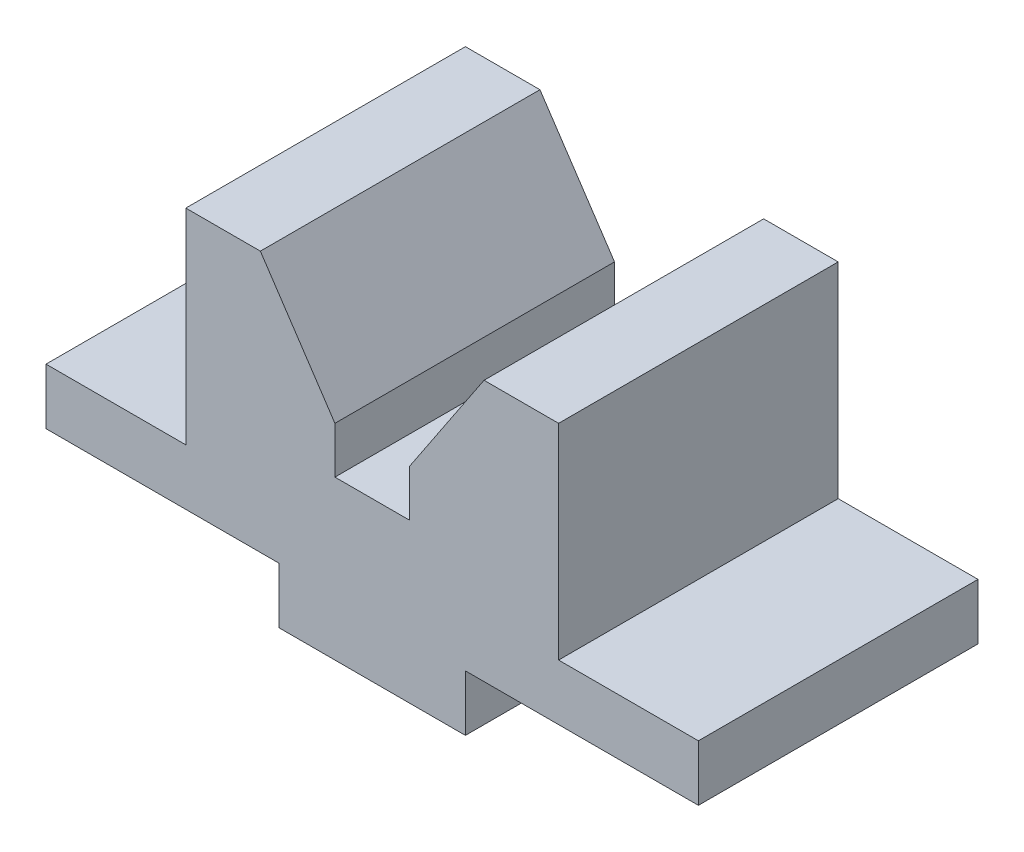
ISO-10303-21;
HEADER;
FILE_DESCRIPTION(('STEP AP214'),'2;1');
FILE_NAME('part.step','',(''),(''),'','','');
FILE_SCHEMA(('AUTOMOTIVE_DESIGN { 1 0 10303 214 1 1 1 1 }'));
ENDSEC;
DATA;
#1=APPLICATION_CONTEXT('core data for automotive mechanical design processes');
#2=APPLICATION_PROTOCOL_DEFINITION('international standard','automotive_design',2000,#1);
#3=PRODUCT_CONTEXT('',#1,'mechanical');
#4=PRODUCT('Part','Part','',(#3));
#5=PRODUCT_RELATED_PRODUCT_CATEGORY('part','',(#4));
#6=PRODUCT_DEFINITION_FORMATION('','',#4);
#7=PRODUCT_DEFINITION_CONTEXT('part definition',#1,'design');
#8=PRODUCT_DEFINITION('design','',#6,#7);
#9=PRODUCT_DEFINITION_SHAPE('','',#8);
#10=(LENGTH_UNIT() NAMED_UNIT(*) SI_UNIT(.MILLI.,.METRE.));
#11=(NAMED_UNIT(*) PLANE_ANGLE_UNIT() SI_UNIT($,.RADIAN.));
#12=(NAMED_UNIT(*) SI_UNIT($,.STERADIAN.) SOLID_ANGLE_UNIT());
#13=UNCERTAINTY_MEASURE_WITH_UNIT(LENGTH_MEASURE(1.E-05),#10,'distance_accuracy_value','');
#14=(GEOMETRIC_REPRESENTATION_CONTEXT(3) GLOBAL_UNCERTAINTY_ASSIGNED_CONTEXT((#13)) GLOBAL_UNIT_ASSIGNED_CONTEXT((#10,
#11,#12)) REPRESENTATION_CONTEXT('',''));
#15=CARTESIAN_POINT('',(0.,0.,0.));
#16=DIRECTION('',(0.,0.,1.));
#17=DIRECTION('',(1.,0.,0.));
#18=AXIS2_PLACEMENT_3D('',#15,#16,#17);
#19=CARTESIAN_POINT('',(20.,34.,15.));
#20=DIRECTION('',(0.,-1.,0.));
#21=DIRECTION('',(0.,0.,-1.));
#22=AXIS2_PLACEMENT_3D('',#19,#20,#21);
#23=PLANE('',#22);
#24=DIRECTION('',(-1.,0.,0.));
#25=VECTOR('',#24,1.);
#26=CARTESIAN_POINT('',(20.,34.,-15.));
#27=LINE('',#26,#25);
#28=CARTESIAN_POINT('',(20.,34.,-15.));
#29=VERTEX_POINT('',#28);
#30=CARTESIAN_POINT('',(12.,34.,-15.));
#31=VERTEX_POINT('',#30);
#32=EDGE_CURVE('E193',#29,#31,#27,.T.);
#33=ORIENTED_EDGE('',*,*,#32,.T.);
#34=DIRECTION('',(0.,0.,-1.));
#35=VECTOR('',#34,1.);
#36=CARTESIAN_POINT('',(12.,34.,15.));
#37=LINE('',#36,#35);
#38=CARTESIAN_POINT('',(12.,34.,15.));
#39=VERTEX_POINT('',#38);
#40=EDGE_CURVE('E11',#39,#31,#37,.T.);
#41=ORIENTED_EDGE('',*,*,#40,.F.);
#42=DIRECTION('',(-1.,0.,0.));
#43=VECTOR('',#42,1.);
#44=CARTESIAN_POINT('',(20.,34.,15.));
#45=LINE('',#44,#43);
#46=CARTESIAN_POINT('',(20.,34.,15.));
#47=VERTEX_POINT('',#46);
#48=EDGE_CURVE('E227',#47,#39,#45,.T.);
#49=ORIENTED_EDGE('',*,*,#48,.F.);
#50=DIRECTION('',(0.,0.,-1.));
#51=VECTOR('',#50,1.);
#52=CARTESIAN_POINT('',(20.,34.,15.));
#53=LINE('',#52,#51);
#54=EDGE_CURVE('E192',#47,#29,#53,.T.);
#55=ORIENTED_EDGE('',*,*,#54,.T.);
#56=EDGE_LOOP('',(#33,#41,#49,#55));
#57=FACE_BOUND('',#56,.T.);
#58=ADVANCED_FACE('F39',(#57),#23,.F.);
#59=CARTESIAN_POINT('',(12.,34.,15.));
#60=DIRECTION('',(0.832050294337844,-0.554700196225229,0.));
#61=DIRECTION('',(0.554700196225229,0.832050294337844,0.));
#62=AXIS2_PLACEMENT_3D('',#59,#60,#61);
#63=PLANE('',#62);
#64=DIRECTION('',(-0.554700196225229,-0.832050294337844,0.));
#65=VECTOR('',#64,1.);
#66=CARTESIAN_POINT('',(12.,34.,-15.));
#67=LINE('',#66,#65);
#68=CARTESIAN_POINT('',(4.,22.,-15.));
#69=VERTEX_POINT('',#68);
#70=EDGE_CURVE('E199',#31,#69,#67,.T.);
#71=ORIENTED_EDGE('',*,*,#70,.T.);
#72=DIRECTION('',(0.,0.,-1.));
#73=VECTOR('',#72,1.);
#74=CARTESIAN_POINT('',(4.,22.,15.));
#75=LINE('',#74,#73);
#76=CARTESIAN_POINT('',(4.,22.,15.));
#77=VERTEX_POINT('',#76);
#78=EDGE_CURVE('E50',#77,#69,#75,.T.);
#79=ORIENTED_EDGE('',*,*,#78,.F.);
#80=DIRECTION('',(-0.554700196225229,-0.832050294337844,0.));
#81=VECTOR('',#80,1.);
#82=CARTESIAN_POINT('',(12.,34.,15.));
#83=LINE('',#82,#81);
#84=EDGE_CURVE('E126',#39,#77,#83,.T.);
#85=ORIENTED_EDGE('',*,*,#84,.F.);
#86=ORIENTED_EDGE('',*,*,#40,.T.);
#87=EDGE_LOOP('',(#71,#79,#85,#86));
#88=FACE_BOUND('',#87,.T.);
#89=ADVANCED_FACE('F340',(#88),#63,.F.);
#90=CARTESIAN_POINT('',(4.,22.,15.));
#91=DIRECTION('',(1.,0.,0.));
#92=DIRECTION('',(0.,1.,0.));
#93=AXIS2_PLACEMENT_3D('',#90,#91,#92);
#94=PLANE('',#93);
#95=DIRECTION('',(0.,-1.,0.));
#96=VECTOR('',#95,1.);
#97=CARTESIAN_POINT('',(4.,22.,-15.));
#98=LINE('',#97,#96);
#99=CARTESIAN_POINT('',(4.,17.,-15.));
#100=VERTEX_POINT('',#99);
#101=EDGE_CURVE('E200',#69,#100,#98,.T.);
#102=ORIENTED_EDGE('',*,*,#101,.T.);
#103=DIRECTION('',(0.,0.,-1.));
#104=VECTOR('',#103,1.);
#105=CARTESIAN_POINT('',(4.,17.,15.));
#106=LINE('',#105,#104);
#107=CARTESIAN_POINT('',(4.,17.,15.));
#108=VERTEX_POINT('',#107);
#109=EDGE_CURVE('E266',#108,#100,#106,.T.);
#110=ORIENTED_EDGE('',*,*,#109,.F.);
#111=DIRECTION('',(0.,-1.,0.));
#112=VECTOR('',#111,1.);
#113=CARTESIAN_POINT('',(4.,22.,15.));
#114=LINE('',#113,#112);
#115=EDGE_CURVE('E272',#77,#108,#114,.T.);
#116=ORIENTED_EDGE('',*,*,#115,.F.);
#117=ORIENTED_EDGE('',*,*,#78,.T.);
#118=EDGE_LOOP('',(#102,#110,#116,#117));
#119=FACE_BOUND('',#118,.T.);
#120=ADVANCED_FACE('F275',(#119),#94,.F.);
#121=CARTESIAN_POINT('',(-4.,17.,15.));
#122=DIRECTION('',(0.,-1.,0.));
#123=DIRECTION('',(0.,0.,-1.));
#124=AXIS2_PLACEMENT_3D('',#121,#122,#123);
#125=PLANE('',#124);
#126=DIRECTION('',(-1.,0.,0.));
#127=VECTOR('',#126,1.);
#128=CARTESIAN_POINT('',(-4.,17.,-15.));
#129=LINE('',#128,#127);
#130=CARTESIAN_POINT('',(-4.,17.,-15.));
#131=VERTEX_POINT('',#130);
#132=EDGE_CURVE('E205',#100,#131,#129,.T.);
#133=ORIENTED_EDGE('',*,*,#132,.T.);
#134=DIRECTION('',(0.,0.,-1.));
#135=VECTOR('',#134,1.);
#136=CARTESIAN_POINT('',(-4.,17.,15.));
#137=LINE('',#136,#135);
#138=CARTESIAN_POINT('',(-4.,17.,15.));
#139=VERTEX_POINT('',#138);
#140=EDGE_CURVE('E261',#139,#131,#137,.T.);
#141=ORIENTED_EDGE('',*,*,#140,.F.);
#142=DIRECTION('',(-1.,0.,0.));
#143=VECTOR('',#142,1.);
#144=CARTESIAN_POINT('',(-4.,17.,15.));
#145=LINE('',#144,#143);
#146=EDGE_CURVE('E295',#108,#139,#145,.T.);
#147=ORIENTED_EDGE('',*,*,#146,.F.);
#148=ORIENTED_EDGE('',*,*,#109,.T.);
#149=EDGE_LOOP('',(#133,#141,#147,#148));
#150=FACE_BOUND('',#149,.T.);
#151=ADVANCED_FACE('F284',(#150),#125,.F.);
#152=CARTESIAN_POINT('',(-4.00000000000001,22.,15.));
#153=DIRECTION('',(-1.,0.,0.));
#154=DIRECTION('',(0.,-1.,0.));
#155=AXIS2_PLACEMENT_3D('',#152,#153,#154);
#156=PLANE('',#155);
#157=DIRECTION('',(0.,1.,0.));
#158=VECTOR('',#157,1.);
#159=CARTESIAN_POINT('',(-4.00000000000001,22.,-15.));
#160=LINE('',#159,#158);
#161=CARTESIAN_POINT('',(-4.00000000000001,22.,-15.));
#162=VERTEX_POINT('',#161);
#163=EDGE_CURVE('E204',#131,#162,#160,.T.);
#164=ORIENTED_EDGE('',*,*,#163,.T.);
#165=DIRECTION('',(0.,0.,-1.));
#166=VECTOR('',#165,1.);
#167=CARTESIAN_POINT('',(-4.00000000000001,22.,15.));
#168=LINE('',#167,#166);
#169=CARTESIAN_POINT('',(-4.00000000000001,22.,15.));
#170=VERTEX_POINT('',#169);
#171=EDGE_CURVE('E259',#170,#162,#168,.T.);
#172=ORIENTED_EDGE('',*,*,#171,.F.);
#173=DIRECTION('',(0.,1.,0.));
#174=VECTOR('',#173,1.);
#175=CARTESIAN_POINT('',(-4.00000000000001,22.,15.));
#176=LINE('',#175,#174);
#177=EDGE_CURVE('E288',#139,#170,#176,.T.);
#178=ORIENTED_EDGE('',*,*,#177,.F.);
#179=ORIENTED_EDGE('',*,*,#140,.T.);
#180=EDGE_LOOP('',(#164,#172,#178,#179));
#181=FACE_BOUND('',#180,.T.);
#182=ADVANCED_FACE('F287',(#181),#156,.F.);
#183=CARTESIAN_POINT('',(-12.,34.,15.));
#184=DIRECTION('',(-0.832050294337843,-0.554700196225229,0.));
#185=DIRECTION('',(0.554700196225229,-0.832050294337843,0.));
#186=AXIS2_PLACEMENT_3D('',#183,#184,#185);
#187=PLANE('',#186);
#188=DIRECTION('',(-0.554700196225229,0.832050294337844,0.));
#189=VECTOR('',#188,1.);
#190=CARTESIAN_POINT('',(-12.,34.,-15.));
#191=LINE('',#190,#189);
#192=CARTESIAN_POINT('',(-12.,34.,-15.));
#193=VERTEX_POINT('',#192);
#194=EDGE_CURVE('E206',#162,#193,#191,.T.);
#195=ORIENTED_EDGE('',*,*,#194,.T.);
#196=DIRECTION('',(0.,0.,-1.));
#197=VECTOR('',#196,1.);
#198=CARTESIAN_POINT('',(-12.,34.,15.));
#199=LINE('',#198,#197);
#200=CARTESIAN_POINT('',(-12.,34.,15.));
#201=VERTEX_POINT('',#200);
#202=EDGE_CURVE('E257',#201,#193,#199,.T.);
#203=ORIENTED_EDGE('',*,*,#202,.F.);
#204=DIRECTION('',(-0.554700196225229,0.832050294337844,0.));
#205=VECTOR('',#204,1.);
#206=CARTESIAN_POINT('',(-12.,34.,15.));
#207=LINE('',#206,#205);
#208=EDGE_CURVE('E292',#170,#201,#207,.T.);
#209=ORIENTED_EDGE('',*,*,#208,.F.);
#210=ORIENTED_EDGE('',*,*,#171,.T.);
#211=EDGE_LOOP('',(#195,#203,#209,#210));
#212=FACE_BOUND('',#211,.T.);
#213=ADVANCED_FACE('F349',(#212),#187,.F.);
#214=CARTESIAN_POINT('',(-20.,34.,15.));
#215=DIRECTION('',(0.,-1.,0.));
#216=DIRECTION('',(1.,0.,0.));
#217=AXIS2_PLACEMENT_3D('',#214,#215,#216);
#218=PLANE('',#217);
#219=DIRECTION('',(-1.,0.,0.));
#220=VECTOR('',#219,1.);
#221=CARTESIAN_POINT('',(-20.,34.,-15.));
#222=LINE('',#221,#220);
#223=CARTESIAN_POINT('',(-20.,34.,-15.));
#224=VERTEX_POINT('',#223);
#225=EDGE_CURVE('E209',#193,#224,#222,.T.);
#226=ORIENTED_EDGE('',*,*,#225,.T.);
#227=DIRECTION('',(0.,0.,-1.));
#228=VECTOR('',#227,1.);
#229=CARTESIAN_POINT('',(-20.,34.,15.));
#230=LINE('',#229,#228);
#231=CARTESIAN_POINT('',(-20.,34.,15.));
#232=VERTEX_POINT('',#231);
#233=EDGE_CURVE('E253',#232,#224,#230,.T.);
#234=ORIENTED_EDGE('',*,*,#233,.F.);
#235=DIRECTION('',(-1.,0.,0.));
#236=VECTOR('',#235,1.);
#237=CARTESIAN_POINT('',(-20.,34.,15.));
#238=LINE('',#237,#236);
#239=EDGE_CURVE('E294',#201,#232,#238,.T.);
#240=ORIENTED_EDGE('',*,*,#239,.F.);
#241=ORIENTED_EDGE('',*,*,#202,.T.);
#242=EDGE_LOOP('',(#226,#234,#240,#241));
#243=FACE_BOUND('',#242,.T.);
#244=ADVANCED_FACE('F351',(#243),#218,.F.);
#245=CARTESIAN_POINT('',(-20.,12.,15.));
#246=DIRECTION('',(1.,0.,0.));
#247=DIRECTION('',(0.,1.,0.));
#248=AXIS2_PLACEMENT_3D('',#245,#246,#247);
#249=PLANE('',#248);
#250=DIRECTION('',(0.,-1.,0.));
#251=VECTOR('',#250,1.);
#252=CARTESIAN_POINT('',(-20.,12.,-15.));
#253=LINE('',#252,#251);
#254=CARTESIAN_POINT('',(-20.,12.,-15.));
#255=VERTEX_POINT('',#254);
#256=EDGE_CURVE('E210',#224,#255,#253,.T.);
#257=ORIENTED_EDGE('',*,*,#256,.T.);
#258=DIRECTION('',(0.,0.,-1.));
#259=VECTOR('',#258,1.);
#260=CARTESIAN_POINT('',(-20.,12.,15.));
#261=LINE('',#260,#259);
#262=CARTESIAN_POINT('',(-20.,12.,15.));
#263=VERTEX_POINT('',#262);
#264=EDGE_CURVE('E251',#263,#255,#261,.T.);
#265=ORIENTED_EDGE('',*,*,#264,.F.);
#266=DIRECTION('',(0.,-1.,0.));
#267=VECTOR('',#266,1.);
#268=CARTESIAN_POINT('',(-20.,12.,15.));
#269=LINE('',#268,#267);
#270=EDGE_CURVE('E300',#232,#263,#269,.T.);
#271=ORIENTED_EDGE('',*,*,#270,.F.);
#272=ORIENTED_EDGE('',*,*,#233,.T.);
#273=EDGE_LOOP('',(#257,#265,#271,#272));
#274=FACE_BOUND('',#273,.T.);
#275=ADVANCED_FACE('F360',(#274),#249,.F.);
#276=CARTESIAN_POINT('',(-35.,12.,15.));
#277=DIRECTION('',(0.,-1.,0.));
#278=DIRECTION('',(1.,0.,0.));
#279=AXIS2_PLACEMENT_3D('',#276,#277,#278);
#280=PLANE('',#279);
#281=DIRECTION('',(-1.,0.,0.));
#282=VECTOR('',#281,1.);
#283=CARTESIAN_POINT('',(-35.,12.,-15.));
#284=LINE('',#283,#282);
#285=CARTESIAN_POINT('',(-35.,12.,-15.));
#286=VERTEX_POINT('',#285);
#287=EDGE_CURVE('E212',#255,#286,#284,.T.);
#288=ORIENTED_EDGE('',*,*,#287,.T.);
#289=DIRECTION('',(0.,0.,-1.));
#290=VECTOR('',#289,1.);
#291=CARTESIAN_POINT('',(-35.,12.,15.));
#292=LINE('',#291,#290);
#293=CARTESIAN_POINT('',(-35.,12.,15.));
#294=VERTEX_POINT('',#293);
#295=EDGE_CURVE('E246',#294,#286,#292,.T.);
#296=ORIENTED_EDGE('',*,*,#295,.F.);
#297=DIRECTION('',(-1.,0.,0.));
#298=VECTOR('',#297,1.);
#299=CARTESIAN_POINT('',(-35.,12.,15.));
#300=LINE('',#299,#298);
#301=EDGE_CURVE('E302',#263,#294,#300,.T.);
#302=ORIENTED_EDGE('',*,*,#301,.F.);
#303=ORIENTED_EDGE('',*,*,#264,.T.);
#304=EDGE_LOOP('',(#288,#296,#302,#303));
#305=FACE_BOUND('',#304,.T.);
#306=ADVANCED_FACE('F361',(#305),#280,.F.);
#307=CARTESIAN_POINT('',(-35.,5.99999999999999,15.));
#308=DIRECTION('',(1.,0.,0.));
#309=DIRECTION('',(0.,0.,-1.));
#310=AXIS2_PLACEMENT_3D('',#307,#308,#309);
#311=PLANE('',#310);
#312=DIRECTION('',(0.,-1.,0.));
#313=VECTOR('',#312,1.);
#314=CARTESIAN_POINT('',(-35.,5.99999999999999,-15.));
#315=LINE('',#314,#313);
#316=CARTESIAN_POINT('',(-35.,5.99999999999999,-15.));
#317=VERTEX_POINT('',#316);
#318=EDGE_CURVE('E215',#286,#317,#315,.T.);
#319=ORIENTED_EDGE('',*,*,#318,.T.);
#320=DIRECTION('',(0.,0.,-1.));
#321=VECTOR('',#320,1.);
#322=CARTESIAN_POINT('',(-35.,5.99999999999999,15.));
#323=LINE('',#322,#321);
#324=CARTESIAN_POINT('',(-35.,5.99999999999999,15.));
#325=VERTEX_POINT('',#324);
#326=EDGE_CURVE('E245',#325,#317,#323,.T.);
#327=ORIENTED_EDGE('',*,*,#326,.F.);
#328=DIRECTION('',(0.,-1.,0.));
#329=VECTOR('',#328,1.);
#330=CARTESIAN_POINT('',(-35.,5.99999999999999,15.));
#331=LINE('',#330,#329);
#332=EDGE_CURVE('E305',#294,#325,#331,.T.);
#333=ORIENTED_EDGE('',*,*,#332,.F.);
#334=ORIENTED_EDGE('',*,*,#295,.T.);
#335=EDGE_LOOP('',(#319,#327,#333,#334));
#336=FACE_BOUND('',#335,.T.);
#337=ADVANCED_FACE('F364',(#336),#311,.F.);
#338=CARTESIAN_POINT('',(-10.,6.,15.));
#339=DIRECTION('',(0.,1.,0.));
#340=DIRECTION('',(-1.,0.,0.));
#341=AXIS2_PLACEMENT_3D('',#338,#339,#340);
#342=PLANE('',#341);
#343=DIRECTION('',(1.,0.,0.));
#344=VECTOR('',#343,1.);
#345=CARTESIAN_POINT('',(-10.,6.,-15.));
#346=LINE('',#345,#344);
#347=CARTESIAN_POINT('',(-10.,6.,-15.));
#348=VERTEX_POINT('',#347);
#349=EDGE_CURVE('E218',#317,#348,#346,.T.);
#350=ORIENTED_EDGE('',*,*,#349,.T.);
#351=DIRECTION('',(0.,0.,-1.));
#352=VECTOR('',#351,1.);
#353=CARTESIAN_POINT('',(-10.,6.,15.));
#354=LINE('',#353,#352);
#355=CARTESIAN_POINT('',(-10.,6.,15.));
#356=VERTEX_POINT('',#355);
#357=EDGE_CURVE('E242',#356,#348,#354,.T.);
#358=ORIENTED_EDGE('',*,*,#357,.F.);
#359=DIRECTION('',(1.,0.,0.));
#360=VECTOR('',#359,1.);
#361=CARTESIAN_POINT('',(-10.,6.,15.));
#362=LINE('',#361,#360);
#363=EDGE_CURVE('E308',#325,#356,#362,.T.);
#364=ORIENTED_EDGE('',*,*,#363,.F.);
#365=ORIENTED_EDGE('',*,*,#326,.T.);
#366=EDGE_LOOP('',(#350,#358,#364,#365));
#367=FACE_BOUND('',#366,.T.);
#368=ADVANCED_FACE('F368',(#367),#342,.F.);
#369=CARTESIAN_POINT('',(-10.,0.,15.));
#370=DIRECTION('',(1.,0.,0.));
#371=DIRECTION('',(0.,0.,-1.));
#372=AXIS2_PLACEMENT_3D('',#369,#370,#371);
#373=PLANE('',#372);
#374=DIRECTION('',(0.,-1.,0.));
#375=VECTOR('',#374,1.);
#376=CARTESIAN_POINT('',(-10.,0.,-15.));
#377=LINE('',#376,#375);
#378=CARTESIAN_POINT('',(-10.,0.,-15.));
#379=VERTEX_POINT('',#378);
#380=EDGE_CURVE('E216',#348,#379,#377,.T.);
#381=ORIENTED_EDGE('',*,*,#380,.T.);
#382=DIRECTION('',(0.,0.,-1.));
#383=VECTOR('',#382,1.);
#384=CARTESIAN_POINT('',(-10.,0.,15.));
#385=LINE('',#384,#383);
#386=CARTESIAN_POINT('',(-10.,0.,15.));
#387=VERTEX_POINT('',#386);
#388=EDGE_CURVE('E236',#387,#379,#385,.T.);
#389=ORIENTED_EDGE('',*,*,#388,.F.);
#390=DIRECTION('',(0.,-1.,0.));
#391=VECTOR('',#390,1.);
#392=CARTESIAN_POINT('',(-10.,0.,15.));
#393=LINE('',#392,#391);
#394=EDGE_CURVE('E306',#356,#387,#393,.T.);
#395=ORIENTED_EDGE('',*,*,#394,.F.);
#396=ORIENTED_EDGE('',*,*,#357,.T.);
#397=EDGE_LOOP('',(#381,#389,#395,#396));
#398=FACE_BOUND('',#397,.T.);
#399=ADVANCED_FACE('F374',(#398),#373,.F.);
#400=CARTESIAN_POINT('',(-10.,0.,15.));
#401=DIRECTION('',(0.,1.,0.));
#402=DIRECTION('',(-1.,0.,0.));
#403=AXIS2_PLACEMENT_3D('',#400,#401,#402);
#404=PLANE('',#403);
#405=DIRECTION('',(1.,0.,0.));
#406=VECTOR('',#405,1.);
#407=CARTESIAN_POINT('',(-10.,0.,-15.));
#408=LINE('',#407,#406);
#409=CARTESIAN_POINT('',(10.,0.,-15.));
#410=VERTEX_POINT('',#409);
#411=EDGE_CURVE('E217',#379,#410,#408,.T.);
#412=ORIENTED_EDGE('',*,*,#411,.T.);
#413=DIRECTION('',(0.,0.,-1.));
#414=VECTOR('',#413,1.);
#415=CARTESIAN_POINT('',(10.,0.,15.));
#416=LINE('',#415,#414);
#417=CARTESIAN_POINT('',(10.,0.,15.));
#418=VERTEX_POINT('',#417);
#419=EDGE_CURVE('E237',#418,#410,#416,.T.);
#420=ORIENTED_EDGE('',*,*,#419,.F.);
#421=DIRECTION('',(1.,0.,0.));
#422=VECTOR('',#421,1.);
#423=CARTESIAN_POINT('',(-10.,0.,15.));
#424=LINE('',#423,#422);
#425=EDGE_CURVE('E307',#387,#418,#424,.T.);
#426=ORIENTED_EDGE('',*,*,#425,.F.);
#427=ORIENTED_EDGE('',*,*,#388,.T.);
#428=EDGE_LOOP('',(#412,#420,#426,#427));
#429=FACE_BOUND('',#428,.T.);
#430=ADVANCED_FACE('F377',(#429),#404,.F.);
#431=CARTESIAN_POINT('',(10.,0.,15.));
#432=DIRECTION('',(-1.,0.,0.));
#433=DIRECTION('',(0.,0.,1.));
#434=AXIS2_PLACEMENT_3D('',#431,#432,#433);
#435=PLANE('',#434);
#436=DIRECTION('',(0.,1.,0.));
#437=VECTOR('',#436,1.);
#438=CARTESIAN_POINT('',(10.,0.,-15.));
#439=LINE('',#438,#437);
#440=CARTESIAN_POINT('',(10.,6.,-15.));
#441=VERTEX_POINT('',#440);
#442=EDGE_CURVE('E225',#410,#441,#439,.T.);
#443=ORIENTED_EDGE('',*,*,#442,.T.);
#444=DIRECTION('',(0.,0.,-1.));
#445=VECTOR('',#444,1.);
#446=CARTESIAN_POINT('',(10.,6.,15.));
#447=LINE('',#446,#445);
#448=CARTESIAN_POINT('',(10.,6.,15.));
#449=VERTEX_POINT('',#448);
#450=EDGE_CURVE('E232',#449,#441,#447,.T.);
#451=ORIENTED_EDGE('',*,*,#450,.F.);
#452=DIRECTION('',(0.,1.,0.));
#453=VECTOR('',#452,1.);
#454=CARTESIAN_POINT('',(10.,0.,15.));
#455=LINE('',#454,#453);
#456=EDGE_CURVE('E315',#418,#449,#455,.T.);
#457=ORIENTED_EDGE('',*,*,#456,.F.);
#458=ORIENTED_EDGE('',*,*,#419,.T.);
#459=EDGE_LOOP('',(#443,#451,#457,#458));
#460=FACE_BOUND('',#459,.T.);
#461=ADVANCED_FACE('F318',(#460),#435,.F.);
#462=CARTESIAN_POINT('',(10.,6.,15.));
#463=DIRECTION('',(0.,1.,0.));
#464=DIRECTION('',(0.,0.,1.));
#465=AXIS2_PLACEMENT_3D('',#462,#463,#464);
#466=PLANE('',#465);
#467=DIRECTION('',(1.,0.,0.));
#468=VECTOR('',#467,1.);
#469=CARTESIAN_POINT('',(10.,6.,-15.));
#470=LINE('',#469,#468);
#471=CARTESIAN_POINT('',(35.,6.,-15.));
#472=VERTEX_POINT('',#471);
#473=EDGE_CURVE('E222',#441,#472,#470,.T.);
#474=ORIENTED_EDGE('',*,*,#473,.T.);
#475=DIRECTION('',(0.,0.,-1.));
#476=VECTOR('',#475,1.);
#477=CARTESIAN_POINT('',(35.,6.,15.));
#478=LINE('',#477,#476);
#479=CARTESIAN_POINT('',(35.,6.,15.));
#480=VERTEX_POINT('',#479);
#481=EDGE_CURVE('E186',#480,#472,#478,.T.);
#482=ORIENTED_EDGE('',*,*,#481,.F.);
#483=DIRECTION('',(1.,0.,0.));
#484=VECTOR('',#483,1.);
#485=CARTESIAN_POINT('',(10.,6.,15.));
#486=LINE('',#485,#484);
#487=EDGE_CURVE('E180',#449,#480,#486,.T.);
#488=ORIENTED_EDGE('',*,*,#487,.F.);
#489=ORIENTED_EDGE('',*,*,#450,.T.);
#490=EDGE_LOOP('',(#474,#482,#488,#489));
#491=FACE_BOUND('',#490,.T.);
#492=ADVANCED_FACE('F325',(#491),#466,.F.);
#493=CARTESIAN_POINT('',(35.,6.,15.));
#494=DIRECTION('',(-1.,0.,0.));
#495=DIRECTION('',(0.,0.,1.));
#496=AXIS2_PLACEMENT_3D('',#493,#494,#495);
#497=PLANE('',#496);
#498=DIRECTION('',(0.,1.,0.));
#499=VECTOR('',#498,1.);
#500=CARTESIAN_POINT('',(35.,6.,-15.));
#501=LINE('',#500,#499);
#502=CARTESIAN_POINT('',(35.,12.,-15.));
#503=VERTEX_POINT('',#502);
#504=EDGE_CURVE('E184',#472,#503,#501,.T.);
#505=ORIENTED_EDGE('',*,*,#504,.T.);
#506=DIRECTION('',(0.,0.,-1.));
#507=VECTOR('',#506,1.);
#508=CARTESIAN_POINT('',(35.,12.,15.));
#509=LINE('',#508,#507);
#510=CARTESIAN_POINT('',(35.,12.,15.));
#511=VERTEX_POINT('',#510);
#512=EDGE_CURVE('E185',#511,#503,#509,.T.);
#513=ORIENTED_EDGE('',*,*,#512,.F.);
#514=DIRECTION('',(0.,1.,0.));
#515=VECTOR('',#514,1.);
#516=CARTESIAN_POINT('',(35.,6.,15.));
#517=LINE('',#516,#515);
#518=EDGE_CURVE('E173',#480,#511,#517,.T.);
#519=ORIENTED_EDGE('',*,*,#518,.F.);
#520=ORIENTED_EDGE('',*,*,#481,.T.);
#521=EDGE_LOOP('',(#505,#513,#519,#520));
#522=FACE_BOUND('',#521,.T.);
#523=ADVANCED_FACE('F183',(#522),#497,.F.);
#524=CARTESIAN_POINT('',(35.,12.,15.));
#525=DIRECTION('',(0.,-1.,0.));
#526=DIRECTION('',(1.,0.,0.));
#527=AXIS2_PLACEMENT_3D('',#524,#525,#526);
#528=PLANE('',#527);
#529=DIRECTION('',(-1.,0.,0.));
#530=VECTOR('',#529,1.);
#531=CARTESIAN_POINT('',(35.,12.,-15.));
#532=LINE('',#531,#530);
#533=CARTESIAN_POINT('',(20.,12.,-15.));
#534=VERTEX_POINT('',#533);
#535=EDGE_CURVE('E114',#503,#534,#532,.T.);
#536=ORIENTED_EDGE('',*,*,#535,.T.);
#537=DIRECTION('',(0.,0.,-1.));
#538=VECTOR('',#537,1.);
#539=CARTESIAN_POINT('',(20.,12.,15.));
#540=LINE('',#539,#538);
#541=CARTESIAN_POINT('',(20.,12.,15.));
#542=VERTEX_POINT('',#541);
#543=EDGE_CURVE('E190',#542,#534,#540,.T.);
#544=ORIENTED_EDGE('',*,*,#543,.F.);
#545=DIRECTION('',(-1.,0.,0.));
#546=VECTOR('',#545,1.);
#547=CARTESIAN_POINT('',(35.,12.,15.));
#548=LINE('',#547,#546);
#549=EDGE_CURVE('E172',#511,#542,#548,.T.);
#550=ORIENTED_EDGE('',*,*,#549,.F.);
#551=ORIENTED_EDGE('',*,*,#512,.T.);
#552=EDGE_LOOP('',(#536,#544,#550,#551));
#553=FACE_BOUND('',#552,.T.);
#554=ADVANCED_FACE('F188',(#553),#528,.F.);
#555=CARTESIAN_POINT('',(20.,12.,15.));
#556=DIRECTION('',(-1.,0.,0.));
#557=DIRECTION('',(0.,0.,1.));
#558=AXIS2_PLACEMENT_3D('',#555,#556,#557);
#559=PLANE('',#558);
#560=DIRECTION('',(0.,1.,0.));
#561=VECTOR('',#560,1.);
#562=CARTESIAN_POINT('',(20.,12.,-15.));
#563=LINE('',#562,#561);
#564=EDGE_CURVE('E120',#534,#29,#563,.T.);
#565=ORIENTED_EDGE('',*,*,#564,.T.);
#566=ORIENTED_EDGE('',*,*,#54,.F.);
#567=DIRECTION('',(0.,1.,0.));
#568=VECTOR('',#567,1.);
#569=CARTESIAN_POINT('',(20.,12.,15.));
#570=LINE('',#569,#568);
#571=EDGE_CURVE('E54',#542,#47,#570,.T.);
#572=ORIENTED_EDGE('',*,*,#571,.F.);
#573=ORIENTED_EDGE('',*,*,#543,.T.);
#574=EDGE_LOOP('',(#565,#566,#572,#573));
#575=FACE_BOUND('',#574,.T.);
#576=ADVANCED_FACE('F327',(#575),#559,.F.);
#577=CARTESIAN_POINT('',(0.,0.,15.));
#578=DIRECTION('',(0.,0.,1.));
#579=DIRECTION('',(1.,0.,0.));
#580=AXIS2_PLACEMENT_3D('',#577,#578,#579);
#581=PLANE('',#580);
#582=ORIENTED_EDGE('',*,*,#48,.T.);
#583=ORIENTED_EDGE('',*,*,#84,.T.);
#584=ORIENTED_EDGE('',*,*,#115,.T.);
#585=ORIENTED_EDGE('',*,*,#146,.T.);
#586=ORIENTED_EDGE('',*,*,#177,.T.);
#587=ORIENTED_EDGE('',*,*,#208,.T.);
#588=ORIENTED_EDGE('',*,*,#239,.T.);
#589=ORIENTED_EDGE('',*,*,#270,.T.);
#590=ORIENTED_EDGE('',*,*,#301,.T.);
#591=ORIENTED_EDGE('',*,*,#332,.T.);
#592=ORIENTED_EDGE('',*,*,#363,.T.);
#593=ORIENTED_EDGE('',*,*,#394,.T.);
#594=ORIENTED_EDGE('',*,*,#425,.T.);
#595=ORIENTED_EDGE('',*,*,#456,.T.);
#596=ORIENTED_EDGE('',*,*,#487,.T.);
#597=ORIENTED_EDGE('',*,*,#518,.T.);
#598=ORIENTED_EDGE('',*,*,#549,.T.);
#599=ORIENTED_EDGE('',*,*,#571,.T.);
#600=EDGE_LOOP('',(#582,#583,#584,#585,#586,#587,#588,#589,#590,#591,#592,#593,#594,#595,#596,
#597,#598,#599));
#601=FACE_BOUND('',#600,.T.);
#602=ADVANCED_FACE('F171',(#601),#581,.T.);
#603=CARTESIAN_POINT('',(0.,0.,-15.));
#604=DIRECTION('',(0.,0.,1.));
#605=DIRECTION('',(1.,0.,0.));
#606=AXIS2_PLACEMENT_3D('',#603,#604,#605);
#607=PLANE('',#606);
#608=ORIENTED_EDGE('',*,*,#32,.F.);
#609=ORIENTED_EDGE('',*,*,#564,.F.);
#610=ORIENTED_EDGE('',*,*,#535,.F.);
#611=ORIENTED_EDGE('',*,*,#504,.F.);
#612=ORIENTED_EDGE('',*,*,#473,.F.);
#613=ORIENTED_EDGE('',*,*,#442,.F.);
#614=ORIENTED_EDGE('',*,*,#411,.F.);
#615=ORIENTED_EDGE('',*,*,#380,.F.);
#616=ORIENTED_EDGE('',*,*,#349,.F.);
#617=ORIENTED_EDGE('',*,*,#318,.F.);
#618=ORIENTED_EDGE('',*,*,#287,.F.);
#619=ORIENTED_EDGE('',*,*,#256,.F.);
#620=ORIENTED_EDGE('',*,*,#225,.F.);
#621=ORIENTED_EDGE('',*,*,#194,.F.);
#622=ORIENTED_EDGE('',*,*,#163,.F.);
#623=ORIENTED_EDGE('',*,*,#132,.F.);
#624=ORIENTED_EDGE('',*,*,#101,.F.);
#625=ORIENTED_EDGE('',*,*,#70,.F.);
#626=EDGE_LOOP('',(#608,#609,#610,#611,#612,#613,#614,#615,#616,#617,#618,#619,#620,#621,#622,
#623,#624,#625));
#627=FACE_BOUND('',#626,.T.);
#628=ADVANCED_FACE('F277',(#627),#607,.F.);
#629=CLOSED_SHELL('',(#58,#89,#120,#151,#182,#213,#244,#275,#306,#337,#368,#399,#430,#461,#492,
#523,#554,#576,#602,#628));
#630=MANIFOLD_SOLID_BREP('B2',#629);
#631=ADVANCED_BREP_SHAPE_REPRESENTATION('',(#18,#630),#14);
#632=SHAPE_DEFINITION_REPRESENTATION(#9,#631);
ENDSEC;
END-ISO-10303-21;
